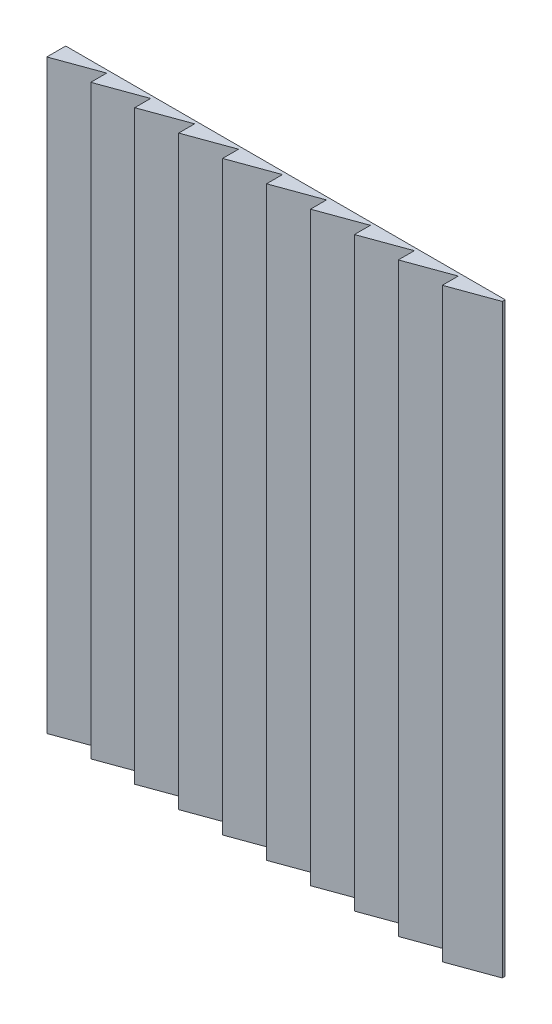
ISO-10303-21;
HEADER;
FILE_DESCRIPTION(('STEP AP214'),'2;1');
FILE_NAME('part.step','',(''),(''),'','','');
FILE_SCHEMA(('AUTOMOTIVE_DESIGN { 1 0 10303 214 1 1 1 1 }'));
ENDSEC;
DATA;
#1=APPLICATION_CONTEXT('core data for automotive mechanical design processes');
#2=APPLICATION_PROTOCOL_DEFINITION('international standard','automotive_design',2000,#1);
#3=PRODUCT_CONTEXT('',#1,'mechanical');
#4=PRODUCT('Part','Part','',(#3));
#5=PRODUCT_RELATED_PRODUCT_CATEGORY('part','',(#4));
#6=PRODUCT_DEFINITION_FORMATION('','',#4);
#7=PRODUCT_DEFINITION_CONTEXT('part definition',#1,'design');
#8=PRODUCT_DEFINITION('design','',#6,#7);
#9=PRODUCT_DEFINITION_SHAPE('','',#8);
#10=(LENGTH_UNIT() NAMED_UNIT(*) SI_UNIT(.MILLI.,.METRE.));
#11=(NAMED_UNIT(*) PLANE_ANGLE_UNIT() SI_UNIT($,.RADIAN.));
#12=(NAMED_UNIT(*) SI_UNIT($,.STERADIAN.) SOLID_ANGLE_UNIT());
#13=UNCERTAINTY_MEASURE_WITH_UNIT(LENGTH_MEASURE(1.E-05),#10,'distance_accuracy_value','');
#14=(GEOMETRIC_REPRESENTATION_CONTEXT(3) GLOBAL_UNCERTAINTY_ASSIGNED_CONTEXT((#13)) GLOBAL_UNIT_ASSIGNED_CONTEXT((#10,
#11,#12)) REPRESENTATION_CONTEXT('',''));
#15=CARTESIAN_POINT('',(0.,0.,0.));
#16=DIRECTION('',(0.,0.,1.));
#17=DIRECTION('',(1.,0.,0.));
#18=AXIS2_PLACEMENT_3D('',#15,#16,#17);
#19=CARTESIAN_POINT('',(0.,-25.4,0.));
#20=DIRECTION('',(0.,0.,-1.));
#21=DIRECTION('',(-1.,0.,0.));
#22=AXIS2_PLACEMENT_3D('',#19,#20,#21);
#23=PLANE('',#22);
#24=DIRECTION('',(-1.,0.,0.));
#25=VECTOR('',#24,1.);
#26=CARTESIAN_POINT('',(0.,25.4,0.));
#27=LINE('',#26,#25);
#28=CARTESIAN_POINT('',(19.05,25.4,0.));
#29=VERTEX_POINT('',#28);
#30=CARTESIAN_POINT('',(-19.05,25.4,0.));
#31=VERTEX_POINT('',#30);
#32=EDGE_CURVE('E11',#29,#31,#27,.T.);
#33=ORIENTED_EDGE('',*,*,#32,.F.);
#34=DIRECTION('',(0.,1.,0.));
#35=VECTOR('',#34,1.);
#36=CARTESIAN_POINT('',(19.05,-25.4,0.));
#37=LINE('',#36,#35);
#38=CARTESIAN_POINT('',(19.05,-25.4,0.));
#39=VERTEX_POINT('',#38);
#40=EDGE_CURVE('E24',#39,#29,#37,.T.);
#41=ORIENTED_EDGE('',*,*,#40,.F.);
#42=DIRECTION('',(-1.,0.,0.));
#43=VECTOR('',#42,1.);
#44=CARTESIAN_POINT('',(0.,-25.4,0.));
#45=LINE('',#44,#43);
#46=CARTESIAN_POINT('',(-19.05,-25.4,0.));
#47=VERTEX_POINT('',#46);
#48=EDGE_CURVE('E358',#39,#47,#45,.T.);
#49=ORIENTED_EDGE('',*,*,#48,.T.);
#50=DIRECTION('',(0.,1.,0.));
#51=VECTOR('',#50,1.);
#52=CARTESIAN_POINT('',(-19.05,-25.4,0.));
#53=LINE('',#52,#51);
#54=EDGE_CURVE('E177',#47,#31,#53,.T.);
#55=ORIENTED_EDGE('',*,*,#54,.T.);
#56=EDGE_LOOP('',(#33,#41,#49,#55));
#57=FACE_BOUND('',#56,.T.);
#58=ADVANCED_FACE('F17',(#57),#23,.T.);
#59=CARTESIAN_POINT('',(19.05,-25.4,0.127));
#60=DIRECTION('',(1.,0.,0.));
#61=DIRECTION('',(0.,0.,-1.));
#62=AXIS2_PLACEMENT_3D('',#59,#60,#61);
#63=PLANE('',#62);
#64=DIRECTION('',(0.,0.,-1.));
#65=VECTOR('',#64,1.);
#66=CARTESIAN_POINT('',(19.05,25.4,0.127));
#67=LINE('',#66,#65);
#68=CARTESIAN_POINT('',(19.05,25.4,0.254000000000011));
#69=VERTEX_POINT('',#68);
#70=EDGE_CURVE('E354',#69,#29,#67,.T.);
#71=ORIENTED_EDGE('',*,*,#70,.F.);
#72=DIRECTION('',(0.,1.,0.));
#73=VECTOR('',#72,1.);
#74=CARTESIAN_POINT('',(19.05,-25.4,0.254000000000011));
#75=LINE('',#74,#73);
#76=CARTESIAN_POINT('',(19.05,-25.4,0.254000000000011));
#77=VERTEX_POINT('',#76);
#78=EDGE_CURVE('E351',#77,#69,#75,.T.);
#79=ORIENTED_EDGE('',*,*,#78,.F.);
#80=DIRECTION('',(0.,0.,-1.));
#81=VECTOR('',#80,1.);
#82=CARTESIAN_POINT('',(19.05,-25.4,0.127));
#83=LINE('',#82,#81);
#84=EDGE_CURVE('E349',#77,#39,#83,.T.);
#85=ORIENTED_EDGE('',*,*,#84,.T.);
#86=ORIENTED_EDGE('',*,*,#40,.T.);
#87=EDGE_LOOP('',(#71,#79,#85,#86));
#88=FACE_BOUND('',#87,.T.);
#89=ADVANCED_FACE('F360',(#88),#63,.T.);
#90=CARTESIAN_POINT('',(17.145,-25.4,0.947363296277119));
#91=DIRECTION('',(0.342020143325669,0.,0.939692620785908));
#92=DIRECTION('',(0.939692620785908,0.,-0.342020143325669));
#93=AXIS2_PLACEMENT_3D('',#90,#91,#92);
#94=PLANE('',#93);
#95=DIRECTION('',(0.939692620785908,0.,-0.342020143325669));
#96=VECTOR('',#95,1.);
#97=CARTESIAN_POINT('',(17.145,25.4,0.947363296277119));
#98=LINE('',#97,#96);
#99=CARTESIAN_POINT('',(15.24,25.4,1.64072659255423));
#100=VERTEX_POINT('',#99);
#101=EDGE_CURVE('E346',#100,#69,#98,.T.);
#102=ORIENTED_EDGE('',*,*,#101,.F.);
#103=DIRECTION('',(0.,1.,0.));
#104=VECTOR('',#103,1.);
#105=CARTESIAN_POINT('',(15.24,-25.4,1.64072659255423));
#106=LINE('',#105,#104);
#107=CARTESIAN_POINT('',(15.24,-25.4,1.64072659255423));
#108=VERTEX_POINT('',#107);
#109=EDGE_CURVE('E343',#108,#100,#106,.T.);
#110=ORIENTED_EDGE('',*,*,#109,.F.);
#111=DIRECTION('',(0.939692620785908,0.,-0.342020143325669));
#112=VECTOR('',#111,1.);
#113=CARTESIAN_POINT('',(17.145,-25.4,0.947363296277119));
#114=LINE('',#113,#112);
#115=EDGE_CURVE('E340',#108,#77,#114,.T.);
#116=ORIENTED_EDGE('',*,*,#115,.T.);
#117=ORIENTED_EDGE('',*,*,#78,.T.);
#118=EDGE_LOOP('',(#102,#110,#116,#117));
#119=FACE_BOUND('',#118,.T.);
#120=ADVANCED_FACE('F365',(#119),#94,.T.);
#121=CARTESIAN_POINT('',(15.24,-25.4,0.947363296277115));
#122=DIRECTION('',(-1.,0.,0.));
#123=DIRECTION('',(0.,0.,1.));
#124=AXIS2_PLACEMENT_3D('',#121,#122,#123);
#125=PLANE('',#124);
#126=DIRECTION('',(0.,0.,1.));
#127=VECTOR('',#126,1.);
#128=CARTESIAN_POINT('',(15.24,25.4,0.947363296277115));
#129=LINE('',#128,#127);
#130=CARTESIAN_POINT('',(15.24,25.4,0.254));
#131=VERTEX_POINT('',#130);
#132=EDGE_CURVE('E337',#131,#100,#129,.T.);
#133=ORIENTED_EDGE('',*,*,#132,.F.);
#134=DIRECTION('',(0.,1.,0.));
#135=VECTOR('',#134,1.);
#136=CARTESIAN_POINT('',(15.24,-25.4,0.254));
#137=LINE('',#136,#135);
#138=CARTESIAN_POINT('',(15.24,-25.4,0.254));
#139=VERTEX_POINT('',#138);
#140=EDGE_CURVE('E334',#139,#131,#137,.T.);
#141=ORIENTED_EDGE('',*,*,#140,.F.);
#142=DIRECTION('',(0.,0.,1.));
#143=VECTOR('',#142,1.);
#144=CARTESIAN_POINT('',(15.24,-25.4,0.947363296277115));
#145=LINE('',#144,#143);
#146=EDGE_CURVE('E331',#139,#108,#145,.T.);
#147=ORIENTED_EDGE('',*,*,#146,.T.);
#148=ORIENTED_EDGE('',*,*,#109,.T.);
#149=EDGE_LOOP('',(#133,#141,#147,#148));
#150=FACE_BOUND('',#149,.T.);
#151=ADVANCED_FACE('F367',(#150),#125,.T.);
#152=CARTESIAN_POINT('',(13.335,-25.4,0.947363296277118));
#153=DIRECTION('',(0.342020143325668,0.,0.939692620785908));
#154=DIRECTION('',(0.939692620785908,0.,-0.342020143325668));
#155=AXIS2_PLACEMENT_3D('',#152,#153,#154);
#156=PLANE('',#155);
#157=DIRECTION('',(0.939692620785908,0.,-0.342020143325669));
#158=VECTOR('',#157,1.);
#159=CARTESIAN_POINT('',(13.335,25.4,0.947363296277118));
#160=LINE('',#159,#158);
#161=CARTESIAN_POINT('',(11.43,25.4,1.64072659255423));
#162=VERTEX_POINT('',#161);
#163=EDGE_CURVE('E328',#162,#131,#160,.T.);
#164=ORIENTED_EDGE('',*,*,#163,.F.);
#165=DIRECTION('',(0.,1.,0.));
#166=VECTOR('',#165,1.);
#167=CARTESIAN_POINT('',(11.43,-25.4,1.64072659255423));
#168=LINE('',#167,#166);
#169=CARTESIAN_POINT('',(11.43,-25.4,1.64072659255423));
#170=VERTEX_POINT('',#169);
#171=EDGE_CURVE('E325',#170,#162,#168,.T.);
#172=ORIENTED_EDGE('',*,*,#171,.F.);
#173=DIRECTION('',(0.939692620785908,0.,-0.342020143325669));
#174=VECTOR('',#173,1.);
#175=CARTESIAN_POINT('',(13.335,-25.4,0.947363296277118));
#176=LINE('',#175,#174);
#177=EDGE_CURVE('E322',#170,#139,#176,.T.);
#178=ORIENTED_EDGE('',*,*,#177,.T.);
#179=ORIENTED_EDGE('',*,*,#140,.T.);
#180=EDGE_LOOP('',(#164,#172,#178,#179));
#181=FACE_BOUND('',#180,.T.);
#182=ADVANCED_FACE('F415',(#181),#156,.T.);
#183=CARTESIAN_POINT('',(11.43,-25.4,0.947363296277115));
#184=DIRECTION('',(-1.,0.,0.));
#185=DIRECTION('',(0.,0.,1.));
#186=AXIS2_PLACEMENT_3D('',#183,#184,#185);
#187=PLANE('',#186);
#188=DIRECTION('',(0.,0.,1.));
#189=VECTOR('',#188,1.);
#190=CARTESIAN_POINT('',(11.43,25.4,0.947363296277115));
#191=LINE('',#190,#189);
#192=CARTESIAN_POINT('',(11.43,25.4,0.254));
#193=VERTEX_POINT('',#192);
#194=EDGE_CURVE('E319',#193,#162,#191,.T.);
#195=ORIENTED_EDGE('',*,*,#194,.F.);
#196=DIRECTION('',(0.,1.,0.));
#197=VECTOR('',#196,1.);
#198=CARTESIAN_POINT('',(11.43,-25.4,0.254));
#199=LINE('',#198,#197);
#200=CARTESIAN_POINT('',(11.43,-25.4,0.254));
#201=VERTEX_POINT('',#200);
#202=EDGE_CURVE('E316',#201,#193,#199,.T.);
#203=ORIENTED_EDGE('',*,*,#202,.F.);
#204=DIRECTION('',(0.,0.,1.));
#205=VECTOR('',#204,1.);
#206=CARTESIAN_POINT('',(11.43,-25.4,0.947363296277115));
#207=LINE('',#206,#205);
#208=EDGE_CURVE('E313',#201,#170,#207,.T.);
#209=ORIENTED_EDGE('',*,*,#208,.T.);
#210=ORIENTED_EDGE('',*,*,#171,.T.);
#211=EDGE_LOOP('',(#195,#203,#209,#210));
#212=FACE_BOUND('',#211,.T.);
#213=ADVANCED_FACE('F413',(#212),#187,.T.);
#214=CARTESIAN_POINT('',(9.525,-25.4,0.947363296277119));
#215=DIRECTION('',(0.342020143325668,0.,0.939692620785909));
#216=DIRECTION('',(0.939692620785909,0.,-0.342020143325668));
#217=AXIS2_PLACEMENT_3D('',#214,#215,#216);
#218=PLANE('',#217);
#219=DIRECTION('',(0.939692620785909,0.,-0.342020143325668));
#220=VECTOR('',#219,1.);
#221=CARTESIAN_POINT('',(9.525,25.4,0.947363296277119));
#222=LINE('',#221,#220);
#223=CARTESIAN_POINT('',(7.62,25.4,1.64072659255423));
#224=VERTEX_POINT('',#223);
#225=EDGE_CURVE('E310',#224,#193,#222,.T.);
#226=ORIENTED_EDGE('',*,*,#225,.F.);
#227=DIRECTION('',(0.,1.,0.));
#228=VECTOR('',#227,1.);
#229=CARTESIAN_POINT('',(7.62,-25.4,1.64072659255423));
#230=LINE('',#229,#228);
#231=CARTESIAN_POINT('',(7.62,-25.4,1.64072659255423));
#232=VERTEX_POINT('',#231);
#233=EDGE_CURVE('E307',#232,#224,#230,.T.);
#234=ORIENTED_EDGE('',*,*,#233,.F.);
#235=DIRECTION('',(0.939692620785909,0.,-0.342020143325668));
#236=VECTOR('',#235,1.);
#237=CARTESIAN_POINT('',(9.525,-25.4,0.947363296277119));
#238=LINE('',#237,#236);
#239=EDGE_CURVE('E304',#232,#201,#238,.T.);
#240=ORIENTED_EDGE('',*,*,#239,.T.);
#241=ORIENTED_EDGE('',*,*,#202,.T.);
#242=EDGE_LOOP('',(#226,#234,#240,#241));
#243=FACE_BOUND('',#242,.T.);
#244=ADVANCED_FACE('F410',(#243),#218,.T.);
#245=CARTESIAN_POINT('',(7.62,-25.4,0.947363296277115));
#246=DIRECTION('',(-1.,0.,0.));
#247=DIRECTION('',(0.,0.,1.));
#248=AXIS2_PLACEMENT_3D('',#245,#246,#247);
#249=PLANE('',#248);
#250=DIRECTION('',(0.,0.,1.));
#251=VECTOR('',#250,1.);
#252=CARTESIAN_POINT('',(7.62,25.4,0.947363296277115));
#253=LINE('',#252,#251);
#254=CARTESIAN_POINT('',(7.62,25.4,0.254));
#255=VERTEX_POINT('',#254);
#256=EDGE_CURVE('E301',#255,#224,#253,.T.);
#257=ORIENTED_EDGE('',*,*,#256,.F.);
#258=DIRECTION('',(0.,1.,0.));
#259=VECTOR('',#258,1.);
#260=CARTESIAN_POINT('',(7.62,-25.4,0.254));
#261=LINE('',#260,#259);
#262=CARTESIAN_POINT('',(7.62,-25.4,0.254));
#263=VERTEX_POINT('',#262);
#264=EDGE_CURVE('E298',#263,#255,#261,.T.);
#265=ORIENTED_EDGE('',*,*,#264,.F.);
#266=DIRECTION('',(0.,0.,1.));
#267=VECTOR('',#266,1.);
#268=CARTESIAN_POINT('',(7.62,-25.4,0.947363296277115));
#269=LINE('',#268,#267);
#270=EDGE_CURVE('E295',#263,#232,#269,.T.);
#271=ORIENTED_EDGE('',*,*,#270,.T.);
#272=ORIENTED_EDGE('',*,*,#233,.T.);
#273=EDGE_LOOP('',(#257,#265,#271,#272));
#274=FACE_BOUND('',#273,.T.);
#275=ADVANCED_FACE('F407',(#274),#249,.T.);
#276=CARTESIAN_POINT('',(5.715,-25.4,0.947363296277119));
#277=DIRECTION('',(0.342020143325668,0.,0.939692620785909));
#278=DIRECTION('',(0.939692620785909,0.,-0.342020143325668));
#279=AXIS2_PLACEMENT_3D('',#276,#277,#278);
#280=PLANE('',#279);
#281=DIRECTION('',(0.939692620785909,0.,-0.342020143325668));
#282=VECTOR('',#281,1.);
#283=CARTESIAN_POINT('',(5.715,25.4,0.947363296277119));
#284=LINE('',#283,#282);
#285=CARTESIAN_POINT('',(3.81000000000006,25.4,1.64072659255423));
#286=VERTEX_POINT('',#285);
#287=EDGE_CURVE('E292',#286,#255,#284,.T.);
#288=ORIENTED_EDGE('',*,*,#287,.F.);
#289=DIRECTION('',(0.,1.,0.));
#290=VECTOR('',#289,1.);
#291=CARTESIAN_POINT('',(3.81000000000006,-25.4,1.64072659255423));
#292=LINE('',#291,#290);
#293=CARTESIAN_POINT('',(3.81000000000006,-25.4,1.64072659255423));
#294=VERTEX_POINT('',#293);
#295=EDGE_CURVE('E289',#294,#286,#292,.T.);
#296=ORIENTED_EDGE('',*,*,#295,.F.);
#297=DIRECTION('',(0.939692620785909,0.,-0.342020143325668));
#298=VECTOR('',#297,1.);
#299=CARTESIAN_POINT('',(5.715,-25.4,0.947363296277119));
#300=LINE('',#299,#298);
#301=EDGE_CURVE('E286',#294,#263,#300,.T.);
#302=ORIENTED_EDGE('',*,*,#301,.T.);
#303=ORIENTED_EDGE('',*,*,#264,.T.);
#304=EDGE_LOOP('',(#288,#296,#302,#303));
#305=FACE_BOUND('',#304,.T.);
#306=ADVANCED_FACE('F404',(#305),#280,.T.);
#307=CARTESIAN_POINT('',(3.81,-25.4,0.947363296277115));
#308=DIRECTION('',(-1.,0.,0.));
#309=DIRECTION('',(0.,0.,1.));
#310=AXIS2_PLACEMENT_3D('',#307,#308,#309);
#311=PLANE('',#310);
#312=DIRECTION('',(0.,0.,1.));
#313=VECTOR('',#312,1.);
#314=CARTESIAN_POINT('',(3.81,25.4,0.947363296277115));
#315=LINE('',#314,#313);
#316=CARTESIAN_POINT('',(3.81,25.4,0.254));
#317=VERTEX_POINT('',#316);
#318=EDGE_CURVE('E283',#317,#286,#315,.T.);
#319=ORIENTED_EDGE('',*,*,#318,.F.);
#320=DIRECTION('',(0.,1.,0.));
#321=VECTOR('',#320,1.);
#322=CARTESIAN_POINT('',(3.81,-25.4,0.254));
#323=LINE('',#322,#321);
#324=CARTESIAN_POINT('',(3.81,-25.4,0.254));
#325=VERTEX_POINT('',#324);
#326=EDGE_CURVE('E280',#325,#317,#323,.T.);
#327=ORIENTED_EDGE('',*,*,#326,.F.);
#328=DIRECTION('',(0.,0.,1.));
#329=VECTOR('',#328,1.);
#330=CARTESIAN_POINT('',(3.81,-25.4,0.947363296277115));
#331=LINE('',#330,#329);
#332=EDGE_CURVE('E277',#325,#294,#331,.T.);
#333=ORIENTED_EDGE('',*,*,#332,.T.);
#334=ORIENTED_EDGE('',*,*,#295,.T.);
#335=EDGE_LOOP('',(#319,#327,#333,#334));
#336=FACE_BOUND('',#335,.T.);
#337=ADVANCED_FACE('F401',(#336),#311,.T.);
#338=CARTESIAN_POINT('',(1.90500000000004,-25.4,0.947363296277119));
#339=DIRECTION('',(0.342020143325668,0.,0.939692620785909));
#340=DIRECTION('',(0.939692620785909,0.,-0.342020143325668));
#341=AXIS2_PLACEMENT_3D('',#338,#339,#340);
#342=PLANE('',#341);
#343=DIRECTION('',(0.939692620785909,0.,-0.342020143325668));
#344=VECTOR('',#343,1.);
#345=CARTESIAN_POINT('',(1.90500000000004,25.4,0.947363296277119));
#346=LINE('',#345,#344);
#347=CARTESIAN_POINT('',(0.,25.4,1.64072659255423));
#348=VERTEX_POINT('',#347);
#349=EDGE_CURVE('E274',#348,#317,#346,.T.);
#350=ORIENTED_EDGE('',*,*,#349,.F.);
#351=DIRECTION('',(0.,1.,0.));
#352=VECTOR('',#351,1.);
#353=CARTESIAN_POINT('',(0.,-25.4,1.64072659255423));
#354=LINE('',#353,#352);
#355=CARTESIAN_POINT('',(0.,-25.4,1.64072659255423));
#356=VERTEX_POINT('',#355);
#357=EDGE_CURVE('E271',#356,#348,#354,.T.);
#358=ORIENTED_EDGE('',*,*,#357,.F.);
#359=DIRECTION('',(0.939692620785909,0.,-0.342020143325668));
#360=VECTOR('',#359,1.);
#361=CARTESIAN_POINT('',(1.90500000000004,-25.4,0.947363296277119));
#362=LINE('',#361,#360);
#363=EDGE_CURVE('E268',#356,#325,#362,.T.);
#364=ORIENTED_EDGE('',*,*,#363,.T.);
#365=ORIENTED_EDGE('',*,*,#326,.T.);
#366=EDGE_LOOP('',(#350,#358,#364,#365));
#367=FACE_BOUND('',#366,.T.);
#368=ADVANCED_FACE('F398',(#367),#342,.T.);
#369=CARTESIAN_POINT('',(0.,-25.4,0.947363296277115));
#370=DIRECTION('',(-1.,0.,0.));
#371=DIRECTION('',(0.,0.,1.));
#372=AXIS2_PLACEMENT_3D('',#369,#370,#371);
#373=PLANE('',#372);
#374=DIRECTION('',(0.,0.,1.));
#375=VECTOR('',#374,1.);
#376=CARTESIAN_POINT('',(0.,25.4,0.947363296277115));
#377=LINE('',#376,#375);
#378=CARTESIAN_POINT('',(0.,25.4,0.254));
#379=VERTEX_POINT('',#378);
#380=EDGE_CURVE('E265',#379,#348,#377,.T.);
#381=ORIENTED_EDGE('',*,*,#380,.F.);
#382=DIRECTION('',(0.,1.,0.));
#383=VECTOR('',#382,1.);
#384=CARTESIAN_POINT('',(0.,-25.4,0.254));
#385=LINE('',#384,#383);
#386=CARTESIAN_POINT('',(0.,-25.4,0.254));
#387=VERTEX_POINT('',#386);
#388=EDGE_CURVE('E262',#387,#379,#385,.T.);
#389=ORIENTED_EDGE('',*,*,#388,.F.);
#390=DIRECTION('',(0.,0.,1.));
#391=VECTOR('',#390,1.);
#392=CARTESIAN_POINT('',(0.,-25.4,0.947363296277115));
#393=LINE('',#392,#391);
#394=EDGE_CURVE('E259',#387,#356,#393,.T.);
#395=ORIENTED_EDGE('',*,*,#394,.T.);
#396=ORIENTED_EDGE('',*,*,#357,.T.);
#397=EDGE_LOOP('',(#381,#389,#395,#396));
#398=FACE_BOUND('',#397,.T.);
#399=ADVANCED_FACE('F395',(#398),#373,.T.);
#400=CARTESIAN_POINT('',(-1.90499999999996,-25.4,0.947363296277121));
#401=DIRECTION('',(0.342020143325668,0.,0.939692620785909));
#402=DIRECTION('',(0.939692620785909,0.,-0.342020143325668));
#403=AXIS2_PLACEMENT_3D('',#400,#401,#402);
#404=PLANE('',#403);
#405=DIRECTION('',(0.939692620785909,0.,-0.342020143325668));
#406=VECTOR('',#405,1.);
#407=CARTESIAN_POINT('',(-1.90499999999996,25.4,0.947363296277121));
#408=LINE('',#407,#406);
#409=CARTESIAN_POINT('',(-3.80999999999994,25.4,1.64072659255423));
#410=VERTEX_POINT('',#409);
#411=EDGE_CURVE('E256',#410,#379,#408,.T.);
#412=ORIENTED_EDGE('',*,*,#411,.F.);
#413=DIRECTION('',(0.,1.,0.));
#414=VECTOR('',#413,1.);
#415=CARTESIAN_POINT('',(-3.80999999999994,-25.4,1.64072659255423));
#416=LINE('',#415,#414);
#417=CARTESIAN_POINT('',(-3.80999999999994,-25.4,1.64072659255423));
#418=VERTEX_POINT('',#417);
#419=EDGE_CURVE('E253',#418,#410,#416,.T.);
#420=ORIENTED_EDGE('',*,*,#419,.F.);
#421=DIRECTION('',(0.939692620785909,0.,-0.342020143325668));
#422=VECTOR('',#421,1.);
#423=CARTESIAN_POINT('',(-1.90499999999996,-25.4,0.947363296277121));
#424=LINE('',#423,#422);
#425=EDGE_CURVE('E250',#418,#387,#424,.T.);
#426=ORIENTED_EDGE('',*,*,#425,.T.);
#427=ORIENTED_EDGE('',*,*,#388,.T.);
#428=EDGE_LOOP('',(#412,#420,#426,#427));
#429=FACE_BOUND('',#428,.T.);
#430=ADVANCED_FACE('F392',(#429),#404,.T.);
#431=CARTESIAN_POINT('',(-3.81,-25.4,0.947363296277115));
#432=DIRECTION('',(-1.,0.,0.));
#433=DIRECTION('',(0.,0.,1.));
#434=AXIS2_PLACEMENT_3D('',#431,#432,#433);
#435=PLANE('',#434);
#436=DIRECTION('',(0.,0.,1.));
#437=VECTOR('',#436,1.);
#438=CARTESIAN_POINT('',(-3.81,25.4,0.947363296277115));
#439=LINE('',#438,#437);
#440=CARTESIAN_POINT('',(-3.81,25.4,0.254));
#441=VERTEX_POINT('',#440);
#442=EDGE_CURVE('E247',#441,#410,#439,.T.);
#443=ORIENTED_EDGE('',*,*,#442,.F.);
#444=DIRECTION('',(0.,1.,0.));
#445=VECTOR('',#444,1.);
#446=CARTESIAN_POINT('',(-3.81,-25.4,0.254));
#447=LINE('',#446,#445);
#448=CARTESIAN_POINT('',(-3.81,-25.4,0.254));
#449=VERTEX_POINT('',#448);
#450=EDGE_CURVE('E244',#449,#441,#447,.T.);
#451=ORIENTED_EDGE('',*,*,#450,.F.);
#452=DIRECTION('',(0.,0.,1.));
#453=VECTOR('',#452,1.);
#454=CARTESIAN_POINT('',(-3.81,-25.4,0.947363296277115));
#455=LINE('',#454,#453);
#456=EDGE_CURVE('E241',#449,#418,#455,.T.);
#457=ORIENTED_EDGE('',*,*,#456,.T.);
#458=ORIENTED_EDGE('',*,*,#419,.T.);
#459=EDGE_LOOP('',(#443,#451,#457,#458));
#460=FACE_BOUND('',#459,.T.);
#461=ADVANCED_FACE('F389',(#460),#435,.T.);
#462=CARTESIAN_POINT('',(-5.715,-25.4,0.947363296277119));
#463=DIRECTION('',(0.342020143325668,0.,0.939692620785909));
#464=DIRECTION('',(0.939692620785909,0.,-0.342020143325668));
#465=AXIS2_PLACEMENT_3D('',#462,#463,#464);
#466=PLANE('',#465);
#467=DIRECTION('',(0.939692620785909,0.,-0.342020143325668));
#468=VECTOR('',#467,1.);
#469=CARTESIAN_POINT('',(-5.715,25.4,0.947363296277119));
#470=LINE('',#469,#468);
#471=CARTESIAN_POINT('',(-7.62,25.4,1.64072659255423));
#472=VERTEX_POINT('',#471);
#473=EDGE_CURVE('E238',#472,#441,#470,.T.);
#474=ORIENTED_EDGE('',*,*,#473,.F.);
#475=DIRECTION('',(0.,1.,0.));
#476=VECTOR('',#475,1.);
#477=CARTESIAN_POINT('',(-7.62,-25.4,1.64072659255423));
#478=LINE('',#477,#476);
#479=CARTESIAN_POINT('',(-7.62,-25.4,1.64072659255423));
#480=VERTEX_POINT('',#479);
#481=EDGE_CURVE('E235',#480,#472,#478,.T.);
#482=ORIENTED_EDGE('',*,*,#481,.F.);
#483=DIRECTION('',(0.939692620785909,0.,-0.342020143325668));
#484=VECTOR('',#483,1.);
#485=CARTESIAN_POINT('',(-5.715,-25.4,0.947363296277119));
#486=LINE('',#485,#484);
#487=EDGE_CURVE('E232',#480,#449,#486,.T.);
#488=ORIENTED_EDGE('',*,*,#487,.T.);
#489=ORIENTED_EDGE('',*,*,#450,.T.);
#490=EDGE_LOOP('',(#474,#482,#488,#489));
#491=FACE_BOUND('',#490,.T.);
#492=ADVANCED_FACE('F386',(#491),#466,.T.);
#493=CARTESIAN_POINT('',(-7.62,-25.4,0.947363296277115));
#494=DIRECTION('',(-1.,0.,0.));
#495=DIRECTION('',(0.,0.,1.));
#496=AXIS2_PLACEMENT_3D('',#493,#494,#495);
#497=PLANE('',#496);
#498=DIRECTION('',(0.,0.,1.));
#499=VECTOR('',#498,1.);
#500=CARTESIAN_POINT('',(-7.62,25.4,0.947363296277115));
#501=LINE('',#500,#499);
#502=CARTESIAN_POINT('',(-7.62,25.4,0.254));
#503=VERTEX_POINT('',#502);
#504=EDGE_CURVE('E229',#503,#472,#501,.T.);
#505=ORIENTED_EDGE('',*,*,#504,.F.);
#506=DIRECTION('',(0.,1.,0.));
#507=VECTOR('',#506,1.);
#508=CARTESIAN_POINT('',(-7.62,-25.4,0.254));
#509=LINE('',#508,#507);
#510=CARTESIAN_POINT('',(-7.62,-25.4,0.254));
#511=VERTEX_POINT('',#510);
#512=EDGE_CURVE('E226',#511,#503,#509,.T.);
#513=ORIENTED_EDGE('',*,*,#512,.F.);
#514=DIRECTION('',(0.,0.,1.));
#515=VECTOR('',#514,1.);
#516=CARTESIAN_POINT('',(-7.62,-25.4,0.947363296277115));
#517=LINE('',#516,#515);
#518=EDGE_CURVE('E223',#511,#480,#517,.T.);
#519=ORIENTED_EDGE('',*,*,#518,.T.);
#520=ORIENTED_EDGE('',*,*,#481,.T.);
#521=EDGE_LOOP('',(#505,#513,#519,#520));
#522=FACE_BOUND('',#521,.T.);
#523=ADVANCED_FACE('F383',(#522),#497,.T.);
#524=CARTESIAN_POINT('',(-9.525,-25.4,0.94736329627712));
#525=DIRECTION('',(0.342020143325668,0.,0.939692620785909));
#526=DIRECTION('',(0.939692620785909,0.,-0.342020143325668));
#527=AXIS2_PLACEMENT_3D('',#524,#525,#526);
#528=PLANE('',#527);
#529=DIRECTION('',(0.939692620785909,0.,-0.342020143325668));
#530=VECTOR('',#529,1.);
#531=CARTESIAN_POINT('',(-9.525,25.4,0.94736329627712));
#532=LINE('',#531,#530);
#533=CARTESIAN_POINT('',(-11.43,25.4,1.64072659255423));
#534=VERTEX_POINT('',#533);
#535=EDGE_CURVE('E220',#534,#503,#532,.T.);
#536=ORIENTED_EDGE('',*,*,#535,.F.);
#537=DIRECTION('',(0.,1.,0.));
#538=VECTOR('',#537,1.);
#539=CARTESIAN_POINT('',(-11.43,-25.4,1.64072659255423));
#540=LINE('',#539,#538);
#541=CARTESIAN_POINT('',(-11.43,-25.4,1.64072659255423));
#542=VERTEX_POINT('',#541);
#543=EDGE_CURVE('E217',#542,#534,#540,.T.);
#544=ORIENTED_EDGE('',*,*,#543,.F.);
#545=DIRECTION('',(0.939692620785909,0.,-0.342020143325668));
#546=VECTOR('',#545,1.);
#547=CARTESIAN_POINT('',(-9.525,-25.4,0.94736329627712));
#548=LINE('',#547,#546);
#549=EDGE_CURVE('E214',#542,#511,#548,.T.);
#550=ORIENTED_EDGE('',*,*,#549,.T.);
#551=ORIENTED_EDGE('',*,*,#512,.T.);
#552=EDGE_LOOP('',(#536,#544,#550,#551));
#553=FACE_BOUND('',#552,.T.);
#554=ADVANCED_FACE('F380',(#553),#528,.T.);
#555=CARTESIAN_POINT('',(-11.43,-25.4,0.947363296277115));
#556=DIRECTION('',(-1.,0.,0.));
#557=DIRECTION('',(0.,0.,1.));
#558=AXIS2_PLACEMENT_3D('',#555,#556,#557);
#559=PLANE('',#558);
#560=DIRECTION('',(0.,0.,1.));
#561=VECTOR('',#560,1.);
#562=CARTESIAN_POINT('',(-11.43,25.4,0.947363296277115));
#563=LINE('',#562,#561);
#564=CARTESIAN_POINT('',(-11.43,25.4,0.254));
#565=VERTEX_POINT('',#564);
#566=EDGE_CURVE('E211',#565,#534,#563,.T.);
#567=ORIENTED_EDGE('',*,*,#566,.F.);
#568=DIRECTION('',(0.,1.,0.));
#569=VECTOR('',#568,1.);
#570=CARTESIAN_POINT('',(-11.43,-25.4,0.254));
#571=LINE('',#570,#569);
#572=CARTESIAN_POINT('',(-11.43,-25.4,0.254));
#573=VERTEX_POINT('',#572);
#574=EDGE_CURVE('E208',#573,#565,#571,.T.);
#575=ORIENTED_EDGE('',*,*,#574,.F.);
#576=DIRECTION('',(0.,0.,1.));
#577=VECTOR('',#576,1.);
#578=CARTESIAN_POINT('',(-11.43,-25.4,0.947363296277115));
#579=LINE('',#578,#577);
#580=EDGE_CURVE('E205',#573,#542,#579,.T.);
#581=ORIENTED_EDGE('',*,*,#580,.T.);
#582=ORIENTED_EDGE('',*,*,#543,.T.);
#583=EDGE_LOOP('',(#567,#575,#581,#582));
#584=FACE_BOUND('',#583,.T.);
#585=ADVANCED_FACE('F377',(#584),#559,.T.);
#586=CARTESIAN_POINT('',(-13.335,-25.4,0.947363296277121));
#587=DIRECTION('',(0.342020143325668,0.,0.939692620785909));
#588=DIRECTION('',(0.939692620785909,0.,-0.342020143325668));
#589=AXIS2_PLACEMENT_3D('',#586,#587,#588);
#590=PLANE('',#589);
#591=DIRECTION('',(0.939692620785909,0.,-0.342020143325668));
#592=VECTOR('',#591,1.);
#593=CARTESIAN_POINT('',(-13.335,25.4,0.947363296277121));
#594=LINE('',#593,#592);
#595=CARTESIAN_POINT('',(-15.24,25.4,1.64072659255423));
#596=VERTEX_POINT('',#595);
#597=EDGE_CURVE('E202',#596,#565,#594,.T.);
#598=ORIENTED_EDGE('',*,*,#597,.F.);
#599=DIRECTION('',(0.,1.,0.));
#600=VECTOR('',#599,1.);
#601=CARTESIAN_POINT('',(-15.24,-25.4,1.64072659255423));
#602=LINE('',#601,#600);
#603=CARTESIAN_POINT('',(-15.24,-25.4,1.64072659255423));
#604=VERTEX_POINT('',#603);
#605=EDGE_CURVE('E199',#604,#596,#602,.T.);
#606=ORIENTED_EDGE('',*,*,#605,.F.);
#607=DIRECTION('',(0.939692620785909,0.,-0.342020143325668));
#608=VECTOR('',#607,1.);
#609=CARTESIAN_POINT('',(-13.335,-25.4,0.947363296277121));
#610=LINE('',#609,#608);
#611=EDGE_CURVE('E196',#604,#573,#610,.T.);
#612=ORIENTED_EDGE('',*,*,#611,.T.);
#613=ORIENTED_EDGE('',*,*,#574,.T.);
#614=EDGE_LOOP('',(#598,#606,#612,#613));
#615=FACE_BOUND('',#614,.T.);
#616=ADVANCED_FACE('F374',(#615),#590,.T.);
#617=CARTESIAN_POINT('',(-15.24,-25.4,0.947363296277115));
#618=DIRECTION('',(-1.,0.,0.));
#619=DIRECTION('',(0.,0.,1.));
#620=AXIS2_PLACEMENT_3D('',#617,#618,#619);
#621=PLANE('',#620);
#622=DIRECTION('',(0.,0.,1.));
#623=VECTOR('',#622,1.);
#624=CARTESIAN_POINT('',(-15.24,25.4,0.947363296277115));
#625=LINE('',#624,#623);
#626=CARTESIAN_POINT('',(-15.24,25.4,0.254));
#627=VERTEX_POINT('',#626);
#628=EDGE_CURVE('E193',#627,#596,#625,.T.);
#629=ORIENTED_EDGE('',*,*,#628,.F.);
#630=DIRECTION('',(0.,1.,0.));
#631=VECTOR('',#630,1.);
#632=CARTESIAN_POINT('',(-15.24,-25.4,0.254));
#633=LINE('',#632,#631);
#634=CARTESIAN_POINT('',(-15.24,-25.4,0.254));
#635=VERTEX_POINT('',#634);
#636=EDGE_CURVE('E191',#635,#627,#633,.T.);
#637=ORIENTED_EDGE('',*,*,#636,.F.);
#638=DIRECTION('',(0.,0.,1.));
#639=VECTOR('',#638,1.);
#640=CARTESIAN_POINT('',(-15.24,-25.4,0.947363296277115));
#641=LINE('',#640,#639);
#642=EDGE_CURVE('E185',#635,#604,#641,.T.);
#643=ORIENTED_EDGE('',*,*,#642,.T.);
#644=ORIENTED_EDGE('',*,*,#605,.T.);
#645=EDGE_LOOP('',(#629,#637,#643,#644));
#646=FACE_BOUND('',#645,.T.);
#647=ADVANCED_FACE('F372',(#646),#621,.T.);
#648=CARTESIAN_POINT('',(-17.145,-25.4,0.94736329627712));
#649=DIRECTION('',(0.342020143325668,0.,0.939692620785909));
#650=DIRECTION('',(0.939692620785909,0.,-0.342020143325668));
#651=AXIS2_PLACEMENT_3D('',#648,#649,#650);
#652=PLANE('',#651);
#653=DIRECTION('',(0.939692620785909,0.,-0.342020143325668));
#654=VECTOR('',#653,1.);
#655=CARTESIAN_POINT('',(-17.145,25.4,0.94736329627712));
#656=LINE('',#655,#654);
#657=CARTESIAN_POINT('',(-19.05,25.4,1.64072659255423));
#658=VERTEX_POINT('',#657);
#659=EDGE_CURVE('E168',#658,#627,#656,.T.);
#660=ORIENTED_EDGE('',*,*,#659,.F.);
#661=DIRECTION('',(0.,1.,0.));
#662=VECTOR('',#661,1.);
#663=CARTESIAN_POINT('',(-19.05,-25.4,1.64072659255423));
#664=LINE('',#663,#662);
#665=CARTESIAN_POINT('',(-19.05,-25.4,1.64072659255423));
#666=VERTEX_POINT('',#665);
#667=EDGE_CURVE('E160',#666,#658,#664,.T.);
#668=ORIENTED_EDGE('',*,*,#667,.F.);
#669=DIRECTION('',(0.939692620785909,0.,-0.342020143325668));
#670=VECTOR('',#669,1.);
#671=CARTESIAN_POINT('',(-17.145,-25.4,0.94736329627712));
#672=LINE('',#671,#670);
#673=EDGE_CURVE('E165',#666,#635,#672,.T.);
#674=ORIENTED_EDGE('',*,*,#673,.T.);
#675=ORIENTED_EDGE('',*,*,#636,.T.);
#676=EDGE_LOOP('',(#660,#668,#674,#675));
#677=FACE_BOUND('',#676,.T.);
#678=ADVANCED_FACE('F162',(#677),#652,.T.);
#679=CARTESIAN_POINT('',(-19.05,-25.4,0.947363296277115));
#680=DIRECTION('',(-1.,0.,0.));
#681=DIRECTION('',(0.,0.,1.));
#682=AXIS2_PLACEMENT_3D('',#679,#680,#681);
#683=PLANE('',#682);
#684=DIRECTION('',(0.,0.,1.));
#685=VECTOR('',#684,1.);
#686=CARTESIAN_POINT('',(-19.05,25.4,0.947363296277115));
#687=LINE('',#686,#685);
#688=EDGE_CURVE('E180',#31,#658,#687,.T.);
#689=ORIENTED_EDGE('',*,*,#688,.F.);
#690=ORIENTED_EDGE('',*,*,#54,.F.);
#691=DIRECTION('',(0.,0.,1.));
#692=VECTOR('',#691,1.);
#693=CARTESIAN_POINT('',(-19.05,-25.4,0.947363296277115));
#694=LINE('',#693,#692);
#695=EDGE_CURVE('E175',#47,#666,#694,.T.);
#696=ORIENTED_EDGE('',*,*,#695,.T.);
#697=ORIENTED_EDGE('',*,*,#667,.T.);
#698=EDGE_LOOP('',(#689,#690,#696,#697));
#699=FACE_BOUND('',#698,.T.);
#700=ADVANCED_FACE('F176',(#699),#683,.T.);
#701=CARTESIAN_POINT('',(0.,-25.4,0.820363296277114));
#702=DIRECTION('',(0.,-1.,0.));
#703=DIRECTION('',(1.,0.,0.));
#704=AXIS2_PLACEMENT_3D('',#701,#702,#703);
#705=PLANE('',#704);
#706=ORIENTED_EDGE('',*,*,#48,.F.);
#707=ORIENTED_EDGE('',*,*,#84,.F.);
#708=ORIENTED_EDGE('',*,*,#115,.F.);
#709=ORIENTED_EDGE('',*,*,#146,.F.);
#710=ORIENTED_EDGE('',*,*,#177,.F.);
#711=ORIENTED_EDGE('',*,*,#208,.F.);
#712=ORIENTED_EDGE('',*,*,#239,.F.);
#713=ORIENTED_EDGE('',*,*,#270,.F.);
#714=ORIENTED_EDGE('',*,*,#301,.F.);
#715=ORIENTED_EDGE('',*,*,#332,.F.);
#716=ORIENTED_EDGE('',*,*,#363,.F.);
#717=ORIENTED_EDGE('',*,*,#394,.F.);
#718=ORIENTED_EDGE('',*,*,#425,.F.);
#719=ORIENTED_EDGE('',*,*,#456,.F.);
#720=ORIENTED_EDGE('',*,*,#487,.F.);
#721=ORIENTED_EDGE('',*,*,#518,.F.);
#722=ORIENTED_EDGE('',*,*,#549,.F.);
#723=ORIENTED_EDGE('',*,*,#580,.F.);
#724=ORIENTED_EDGE('',*,*,#611,.F.);
#725=ORIENTED_EDGE('',*,*,#642,.F.);
#726=ORIENTED_EDGE('',*,*,#673,.F.);
#727=ORIENTED_EDGE('',*,*,#695,.F.);
#728=EDGE_LOOP('',(#706,#707,#708,#709,#710,#711,#712,#713,#714,#715,#716,#717,#718,#719,#720,
#721,#722,#723,#724,#725,#726,#727));
#729=FACE_BOUND('',#728,.T.);
#730=ADVANCED_FACE('F182',(#729),#705,.T.);
#731=CARTESIAN_POINT('',(0.,25.4,0.820363296277114));
#732=DIRECTION('',(0.,-1.,0.));
#733=DIRECTION('',(1.,0.,0.));
#734=AXIS2_PLACEMENT_3D('',#731,#732,#733);
#735=PLANE('',#734);
#736=ORIENTED_EDGE('',*,*,#32,.T.);
#737=ORIENTED_EDGE('',*,*,#688,.T.);
#738=ORIENTED_EDGE('',*,*,#659,.T.);
#739=ORIENTED_EDGE('',*,*,#628,.T.);
#740=ORIENTED_EDGE('',*,*,#597,.T.);
#741=ORIENTED_EDGE('',*,*,#566,.T.);
#742=ORIENTED_EDGE('',*,*,#535,.T.);
#743=ORIENTED_EDGE('',*,*,#504,.T.);
#744=ORIENTED_EDGE('',*,*,#473,.T.);
#745=ORIENTED_EDGE('',*,*,#442,.T.);
#746=ORIENTED_EDGE('',*,*,#411,.T.);
#747=ORIENTED_EDGE('',*,*,#380,.T.);
#748=ORIENTED_EDGE('',*,*,#349,.T.);
#749=ORIENTED_EDGE('',*,*,#318,.T.);
#750=ORIENTED_EDGE('',*,*,#287,.T.);
#751=ORIENTED_EDGE('',*,*,#256,.T.);
#752=ORIENTED_EDGE('',*,*,#225,.T.);
#753=ORIENTED_EDGE('',*,*,#194,.T.);
#754=ORIENTED_EDGE('',*,*,#163,.T.);
#755=ORIENTED_EDGE('',*,*,#132,.T.);
#756=ORIENTED_EDGE('',*,*,#101,.T.);
#757=ORIENTED_EDGE('',*,*,#70,.T.);
#758=EDGE_LOOP('',(#736,#737,#738,#739,#740,#741,#742,#743,#744,#745,#746,#747,#748,#749,#750,
#751,#752,#753,#754,#755,#756,#757));
#759=FACE_BOUND('',#758,.T.);
#760=ADVANCED_FACE('F363',(#759),#735,.F.);
#761=CLOSED_SHELL('',(#58,#89,#120,#151,#182,#213,#244,#275,#306,#337,#368,#399,#430,#461,#492,
#523,#554,#585,#616,#647,#678,#700,#730,#760));
#762=MANIFOLD_SOLID_BREP('B1',#761);
#763=ADVANCED_BREP_SHAPE_REPRESENTATION('',(#18,#762),#14);
#764=SHAPE_DEFINITION_REPRESENTATION(#9,#763);
ENDSEC;
END-ISO-10303-21;
